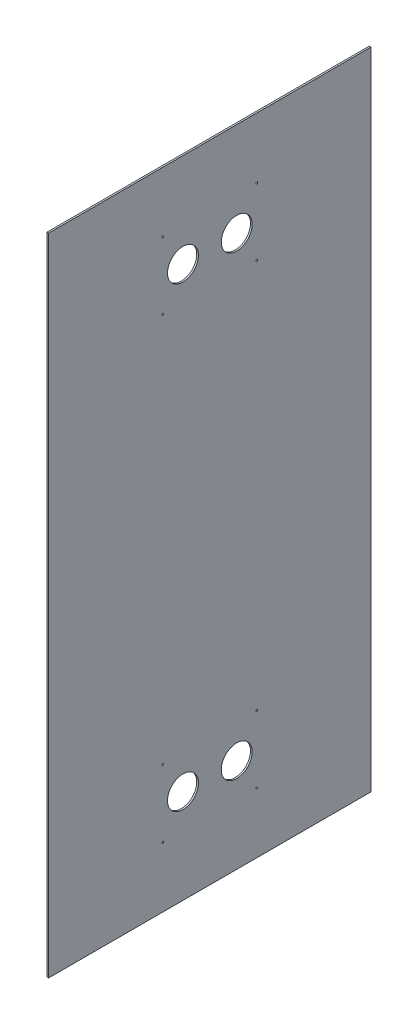
ISO-10303-21;
HEADER;
FILE_DESCRIPTION(('STEP AP214'),'2;1');
FILE_NAME('part.step','',(''),(''),'','','');
FILE_SCHEMA(('AUTOMOTIVE_DESIGN { 1 0 10303 214 1 1 1 1 }'));
ENDSEC;
DATA;
#1=APPLICATION_CONTEXT('core data for automotive mechanical design processes');
#2=APPLICATION_PROTOCOL_DEFINITION('international standard','automotive_design',2000,#1);
#3=PRODUCT_CONTEXT('',#1,'mechanical');
#4=PRODUCT('Part','Part','',(#3));
#5=PRODUCT_RELATED_PRODUCT_CATEGORY('part','',(#4));
#6=PRODUCT_DEFINITION_FORMATION('','',#4);
#7=PRODUCT_DEFINITION_CONTEXT('part definition',#1,'design');
#8=PRODUCT_DEFINITION('design','',#6,#7);
#9=PRODUCT_DEFINITION_SHAPE('','',#8);
#10=(LENGTH_UNIT() NAMED_UNIT(*) SI_UNIT(.MILLI.,.METRE.));
#11=(NAMED_UNIT(*) PLANE_ANGLE_UNIT() SI_UNIT($,.RADIAN.));
#12=(NAMED_UNIT(*) SI_UNIT($,.STERADIAN.) SOLID_ANGLE_UNIT());
#13=UNCERTAINTY_MEASURE_WITH_UNIT(LENGTH_MEASURE(1.E-05),#10,'distance_accuracy_value','');
#14=(GEOMETRIC_REPRESENTATION_CONTEXT(3) GLOBAL_UNCERTAINTY_ASSIGNED_CONTEXT((#13)) GLOBAL_UNIT_ASSIGNED_CONTEXT((#10,
#11,#12)) REPRESENTATION_CONTEXT('',''));
#15=CARTESIAN_POINT('',(0.,0.,0.));
#16=DIRECTION('',(0.,0.,1.));
#17=DIRECTION('',(1.,0.,0.));
#18=AXIS2_PLACEMENT_3D('',#15,#16,#17);
#19=CARTESIAN_POINT('',(3.175,-609.6,304.8));
#20=DIRECTION('',(0.,0.,-1.));
#21=DIRECTION('',(-1.,0.,0.));
#22=AXIS2_PLACEMENT_3D('',#19,#20,#21);
#23=PLANE('',#22);
#24=DIRECTION('',(0.,-1.,0.));
#25=VECTOR('',#24,1.);
#26=CARTESIAN_POINT('',(0.,-609.6,304.8));
#27=LINE('',#26,#25);
#28=CARTESIAN_POINT('',(0.,609.6,304.8));
#29=VERTEX_POINT('',#28);
#30=CARTESIAN_POINT('',(0.,-609.6,304.8));
#31=VERTEX_POINT('',#30);
#32=EDGE_CURVE('E100',#29,#31,#27,.T.);
#33=ORIENTED_EDGE('',*,*,#32,.T.);
#34=DIRECTION('',(-1.,0.,0.));
#35=VECTOR('',#34,1.);
#36=CARTESIAN_POINT('',(3.175,-609.6,304.8));
#37=LINE('',#36,#35);
#38=CARTESIAN_POINT('',(3.175,-609.6,304.8));
#39=VERTEX_POINT('',#38);
#40=EDGE_CURVE('E11',#39,#31,#37,.T.);
#41=ORIENTED_EDGE('',*,*,#40,.F.);
#42=DIRECTION('',(0.,-1.,0.));
#43=VECTOR('',#42,1.);
#44=CARTESIAN_POINT('',(3.175,-609.6,304.8));
#45=LINE('',#44,#43);
#46=CARTESIAN_POINT('',(3.175,609.6,304.8));
#47=VERTEX_POINT('',#46);
#48=EDGE_CURVE('E88',#47,#39,#45,.T.);
#49=ORIENTED_EDGE('',*,*,#48,.F.);
#50=DIRECTION('',(-1.,0.,0.));
#51=VECTOR('',#50,1.);
#52=CARTESIAN_POINT('',(3.175,609.6,304.8));
#53=LINE('',#52,#51);
#54=EDGE_CURVE('E96',#47,#29,#53,.T.);
#55=ORIENTED_EDGE('',*,*,#54,.T.);
#56=EDGE_LOOP('',(#33,#41,#49,#55));
#57=FACE_BOUND('',#56,.T.);
#58=ADVANCED_FACE('F37',(#57),#23,.F.);
#59=CARTESIAN_POINT('',(3.175,-609.6,-304.8));
#60=DIRECTION('',(0.,1.,0.));
#61=DIRECTION('',(0.,0.,1.));
#62=AXIS2_PLACEMENT_3D('',#59,#60,#61);
#63=PLANE('',#62);
#64=DIRECTION('',(0.,0.,-1.));
#65=VECTOR('',#64,1.);
#66=CARTESIAN_POINT('',(0.,-609.6,-304.8));
#67=LINE('',#66,#65);
#68=CARTESIAN_POINT('',(0.,-609.6,-304.8));
#69=VERTEX_POINT('',#68);
#70=EDGE_CURVE('E92',#31,#69,#67,.T.);
#71=ORIENTED_EDGE('',*,*,#70,.T.);
#72=DIRECTION('',(-1.,0.,0.));
#73=VECTOR('',#72,1.);
#74=CARTESIAN_POINT('',(3.175,-609.6,-304.8));
#75=LINE('',#74,#73);
#76=CARTESIAN_POINT('',(3.175,-609.6,-304.8));
#77=VERTEX_POINT('',#76);
#78=EDGE_CURVE('E45',#77,#69,#75,.T.);
#79=ORIENTED_EDGE('',*,*,#78,.F.);
#80=DIRECTION('',(0.,0.,-1.));
#81=VECTOR('',#80,1.);
#82=CARTESIAN_POINT('',(3.175,-609.6,-304.8));
#83=LINE('',#82,#81);
#84=EDGE_CURVE('E83',#39,#77,#83,.T.);
#85=ORIENTED_EDGE('',*,*,#84,.F.);
#86=ORIENTED_EDGE('',*,*,#40,.T.);
#87=EDGE_LOOP('',(#71,#79,#85,#86));
#88=FACE_BOUND('',#87,.T.);
#89=ADVANCED_FACE('F91',(#88),#63,.F.);
#90=CARTESIAN_POINT('',(3.175,-609.6,-304.8));
#91=DIRECTION('',(0.,0.,1.));
#92=DIRECTION('',(1.,0.,0.));
#93=AXIS2_PLACEMENT_3D('',#90,#91,#92);
#94=PLANE('',#93);
#95=DIRECTION('',(0.,1.,0.));
#96=VECTOR('',#95,1.);
#97=CARTESIAN_POINT('',(0.,-609.6,-304.8));
#98=LINE('',#97,#96);
#99=CARTESIAN_POINT('',(0.,609.6,-304.8));
#100=VERTEX_POINT('',#99);
#101=EDGE_CURVE('E70',#69,#100,#98,.T.);
#102=ORIENTED_EDGE('',*,*,#101,.T.);
#103=DIRECTION('',(-1.,0.,0.));
#104=VECTOR('',#103,1.);
#105=CARTESIAN_POINT('',(3.175,609.6,-304.8));
#106=LINE('',#105,#104);
#107=CARTESIAN_POINT('',(3.175,609.6,-304.8));
#108=VERTEX_POINT('',#107);
#109=EDGE_CURVE('E93',#108,#100,#106,.T.);
#110=ORIENTED_EDGE('',*,*,#109,.F.);
#111=DIRECTION('',(0.,1.,0.));
#112=VECTOR('',#111,1.);
#113=CARTESIAN_POINT('',(3.175,-609.6,-304.8));
#114=LINE('',#113,#112);
#115=EDGE_CURVE('E86',#77,#108,#114,.T.);
#116=ORIENTED_EDGE('',*,*,#115,.F.);
#117=ORIENTED_EDGE('',*,*,#78,.T.);
#118=EDGE_LOOP('',(#102,#110,#116,#117));
#119=FACE_BOUND('',#118,.T.);
#120=ADVANCED_FACE('F94',(#119),#94,.F.);
#121=CARTESIAN_POINT('',(3.175,609.6,-304.8));
#122=DIRECTION('',(0.,-1.,0.));
#123=DIRECTION('',(0.,0.,-1.));
#124=AXIS2_PLACEMENT_3D('',#121,#122,#123);
#125=PLANE('',#124);
#126=DIRECTION('',(0.,0.,1.));
#127=VECTOR('',#126,1.);
#128=CARTESIAN_POINT('',(0.,609.6,-304.8));
#129=LINE('',#128,#127);
#130=EDGE_CURVE('E76',#100,#29,#129,.T.);
#131=ORIENTED_EDGE('',*,*,#130,.T.);
#132=ORIENTED_EDGE('',*,*,#54,.F.);
#133=DIRECTION('',(0.,0.,1.));
#134=VECTOR('',#133,1.);
#135=CARTESIAN_POINT('',(3.175,609.6,-304.8));
#136=LINE('',#135,#134);
#137=EDGE_CURVE('E53',#108,#47,#136,.T.);
#138=ORIENTED_EDGE('',*,*,#137,.F.);
#139=ORIENTED_EDGE('',*,*,#109,.T.);
#140=EDGE_LOOP('',(#131,#132,#138,#139));
#141=FACE_BOUND('',#140,.T.);
#142=ADVANCED_FACE('F108',(#141),#125,.F.);
#143=CARTESIAN_POINT('',(3.175,0.,0.));
#144=DIRECTION('',(1.,0.,0.));
#145=DIRECTION('',(0.,0.,-1.));
#146=AXIS2_PLACEMENT_3D('',#143,#144,#145);
#147=PLANE('',#146);
#148=CARTESIAN_POINT('',(3.175,368.3,-88.8999999999999));
#149=DIRECTION('',(-1.,0.,0.));
#150=DIRECTION('',(0.,0.,-1.));
#151=AXIS2_PLACEMENT_3D('',#148,#149,#150);
#152=CIRCLE('',#151,1.58749999999993);
#153=CARTESIAN_POINT('',(3.175,368.3,-90.4874999999999));
#154=VERTEX_POINT('',#153);
#155=EDGE_CURVE('E175',#154,#154,#152,.T.);
#156=ORIENTED_EDGE('',*,*,#155,.T.);
#157=EDGE_LOOP('',(#156));
#158=FACE_BOUND('',#157,.T.);
#159=CARTESIAN_POINT('',(3.175,495.3,88.9));
#160=DIRECTION('',(-1.,0.,0.));
#161=DIRECTION('',(0.,0.,-1.));
#162=AXIS2_PLACEMENT_3D('',#159,#160,#161);
#163=CIRCLE('',#162,1.58750000000005);
#164=CARTESIAN_POINT('',(3.175,495.3,87.3125));
#165=VERTEX_POINT('',#164);
#166=EDGE_CURVE('E168',#165,#165,#163,.T.);
#167=ORIENTED_EDGE('',*,*,#166,.T.);
#168=EDGE_LOOP('',(#167));
#169=FACE_BOUND('',#168,.T.);
#170=CARTESIAN_POINT('',(3.175,495.3,-88.9));
#171=DIRECTION('',(-1.,0.,0.));
#172=DIRECTION('',(0.,0.,-1.));
#173=AXIS2_PLACEMENT_3D('',#170,#171,#172);
#174=CIRCLE('',#173,1.58750000000005);
#175=CARTESIAN_POINT('',(3.175,495.3,-90.4875));
#176=VERTEX_POINT('',#175);
#177=EDGE_CURVE('E180',#176,#176,#174,.T.);
#178=ORIENTED_EDGE('',*,*,#177,.T.);
#179=EDGE_LOOP('',(#178));
#180=FACE_BOUND('',#179,.T.);
#181=CARTESIAN_POINT('',(3.175,368.3,88.9000000000001));
#182=DIRECTION('',(-1.,0.,0.));
#183=DIRECTION('',(0.,0.,-1.));
#184=AXIS2_PLACEMENT_3D('',#181,#182,#183);
#185=CIRCLE('',#184,1.58750000000005);
#186=CARTESIAN_POINT('',(3.175,368.3,87.3125));
#187=VERTEX_POINT('',#186);
#188=EDGE_CURVE('E162',#187,#187,#185,.T.);
#189=ORIENTED_EDGE('',*,*,#188,.T.);
#190=EDGE_LOOP('',(#189));
#191=FACE_BOUND('',#190,.T.);
#192=CARTESIAN_POINT('',(3.175,431.8,50.8000000000001));
#193=DIRECTION('',(-1.,0.,0.));
#194=DIRECTION('',(0.,0.,-1.));
#195=AXIS2_PLACEMENT_3D('',#192,#193,#194);
#196=CIRCLE('',#195,29.21);
#197=CARTESIAN_POINT('',(3.175,431.8,21.5900000000001));
#198=VERTEX_POINT('',#197);
#199=EDGE_CURVE('E157',#198,#198,#196,.T.);
#200=ORIENTED_EDGE('',*,*,#199,.T.);
#201=EDGE_LOOP('',(#200));
#202=FACE_BOUND('',#201,.T.);
#203=CARTESIAN_POINT('',(3.175,431.8,-50.8));
#204=DIRECTION('',(-1.,0.,0.));
#205=DIRECTION('',(0.,0.,-1.));
#206=AXIS2_PLACEMENT_3D('',#203,#204,#205);
#207=CIRCLE('',#206,29.21);
#208=CARTESIAN_POINT('',(3.175,431.8,-80.01));
#209=VERTEX_POINT('',#208);
#210=EDGE_CURVE('E150',#209,#209,#207,.T.);
#211=ORIENTED_EDGE('',*,*,#210,.T.);
#212=EDGE_LOOP('',(#211));
#213=FACE_BOUND('',#212,.T.);
#214=CARTESIAN_POINT('',(3.175,-368.3,-88.8999999999999));
#215=DIRECTION('',(1.,0.,0.));
#216=DIRECTION('',(0.,0.,-1.));
#217=AXIS2_PLACEMENT_3D('',#214,#215,#216);
#218=CIRCLE('',#217,1.58749999999993);
#219=CARTESIAN_POINT('',(3.175,-368.3,-90.4874999999999));
#220=VERTEX_POINT('',#219);
#221=EDGE_CURVE('E139',#220,#220,#218,.T.);
#222=ORIENTED_EDGE('',*,*,#221,.F.);
#223=EDGE_LOOP('',(#222));
#224=FACE_BOUND('',#223,.T.);
#225=CARTESIAN_POINT('',(3.175,-495.3,88.9));
#226=DIRECTION('',(1.,0.,0.));
#227=DIRECTION('',(0.,0.,-1.));
#228=AXIS2_PLACEMENT_3D('',#225,#226,#227);
#229=CIRCLE('',#228,1.58750000000005);
#230=CARTESIAN_POINT('',(3.175,-495.3,87.3125));
#231=VERTEX_POINT('',#230);
#232=EDGE_CURVE('E132',#231,#231,#229,.T.);
#233=ORIENTED_EDGE('',*,*,#232,.F.);
#234=EDGE_LOOP('',(#233));
#235=FACE_BOUND('',#234,.T.);
#236=CARTESIAN_POINT('',(3.175,-495.3,-88.9));
#237=DIRECTION('',(1.,0.,0.));
#238=DIRECTION('',(0.,0.,-1.));
#239=AXIS2_PLACEMENT_3D('',#236,#237,#238);
#240=CIRCLE('',#239,1.58750000000005);
#241=CARTESIAN_POINT('',(3.175,-495.3,-90.4875));
#242=VERTEX_POINT('',#241);
#243=EDGE_CURVE('E144',#242,#242,#240,.T.);
#244=ORIENTED_EDGE('',*,*,#243,.F.);
#245=EDGE_LOOP('',(#244));
#246=FACE_BOUND('',#245,.T.);
#247=CARTESIAN_POINT('',(3.175,-368.3,88.9000000000001));
#248=DIRECTION('',(1.,0.,0.));
#249=DIRECTION('',(0.,0.,-1.));
#250=AXIS2_PLACEMENT_3D('',#247,#248,#249);
#251=CIRCLE('',#250,1.58750000000005);
#252=CARTESIAN_POINT('',(3.175,-368.3,87.3125));
#253=VERTEX_POINT('',#252);
#254=EDGE_CURVE('E126',#253,#253,#251,.T.);
#255=ORIENTED_EDGE('',*,*,#254,.F.);
#256=EDGE_LOOP('',(#255));
#257=FACE_BOUND('',#256,.T.);
#258=CARTESIAN_POINT('',(3.175,-431.8,50.8000000000001));
#259=DIRECTION('',(1.,0.,0.));
#260=DIRECTION('',(0.,0.,-1.));
#261=AXIS2_PLACEMENT_3D('',#258,#259,#260);
#262=CIRCLE('',#261,29.21);
#263=CARTESIAN_POINT('',(3.175,-431.8,21.5900000000001));
#264=VERTEX_POINT('',#263);
#265=EDGE_CURVE('E121',#264,#264,#262,.T.);
#266=ORIENTED_EDGE('',*,*,#265,.F.);
#267=EDGE_LOOP('',(#266));
#268=FACE_BOUND('',#267,.T.);
#269=CARTESIAN_POINT('',(3.175,-431.8,-50.8));
#270=DIRECTION('',(1.,0.,0.));
#271=DIRECTION('',(0.,0.,-1.));
#272=AXIS2_PLACEMENT_3D('',#269,#270,#271);
#273=CIRCLE('',#272,29.21);
#274=CARTESIAN_POINT('',(3.175,-431.8,-80.01));
#275=VERTEX_POINT('',#274);
#276=EDGE_CURVE('E114',#275,#275,#273,.T.);
#277=ORIENTED_EDGE('',*,*,#276,.F.);
#278=EDGE_LOOP('',(#277));
#279=FACE_BOUND('',#278,.T.);
#280=ORIENTED_EDGE('',*,*,#48,.T.);
#281=ORIENTED_EDGE('',*,*,#84,.T.);
#282=ORIENTED_EDGE('',*,*,#115,.T.);
#283=ORIENTED_EDGE('',*,*,#137,.T.);
#284=EDGE_LOOP('',(#280,#281,#282,#283));
#285=FACE_BOUND('',#284,.T.);
#286=ADVANCED_FACE('F84',(#158,#169,#180,#191,#202,#213,#224,#235,#246,#257,#268,#279,#285),
#147,.T.);
#287=CARTESIAN_POINT('',(0.,0.,0.));
#288=DIRECTION('',(1.,0.,0.));
#289=DIRECTION('',(0.,0.,-1.));
#290=AXIS2_PLACEMENT_3D('',#287,#288,#289);
#291=PLANE('',#290);
#292=CARTESIAN_POINT('',(0.,368.3,-88.8999999999999));
#293=DIRECTION('',(-1.,0.,0.));
#294=DIRECTION('',(0.,0.,-1.));
#295=AXIS2_PLACEMENT_3D('',#292,#293,#294);
#296=CIRCLE('',#295,1.58749999999993);
#297=CARTESIAN_POINT('',(0.,368.3,-90.4874999999999));
#298=VERTEX_POINT('',#297);
#299=EDGE_CURVE('E165',#298,#298,#296,.T.);
#300=ORIENTED_EDGE('',*,*,#299,.F.);
#301=EDGE_LOOP('',(#300));
#302=FACE_BOUND('',#301,.T.);
#303=CARTESIAN_POINT('',(0.,495.3,88.9));
#304=DIRECTION('',(-1.,0.,0.));
#305=DIRECTION('',(0.,0.,-1.));
#306=AXIS2_PLACEMENT_3D('',#303,#304,#305);
#307=CIRCLE('',#306,1.58750000000005);
#308=CARTESIAN_POINT('',(0.,495.3,87.3125));
#309=VERTEX_POINT('',#308);
#310=EDGE_CURVE('E171',#309,#309,#307,.T.);
#311=ORIENTED_EDGE('',*,*,#310,.F.);
#312=EDGE_LOOP('',(#311));
#313=FACE_BOUND('',#312,.T.);
#314=CARTESIAN_POINT('',(0.,495.3,-88.9));
#315=DIRECTION('',(-1.,0.,0.));
#316=DIRECTION('',(0.,0.,-1.));
#317=AXIS2_PLACEMENT_3D('',#314,#315,#316);
#318=CIRCLE('',#317,1.58750000000005);
#319=CARTESIAN_POINT('',(0.,495.3,-90.4875));
#320=VERTEX_POINT('',#319);
#321=EDGE_CURVE('E172',#320,#320,#318,.T.);
#322=ORIENTED_EDGE('',*,*,#321,.F.);
#323=EDGE_LOOP('',(#322));
#324=FACE_BOUND('',#323,.T.);
#325=CARTESIAN_POINT('',(0.,368.3,88.9000000000001));
#326=DIRECTION('',(-1.,0.,0.));
#327=DIRECTION('',(0.,0.,-1.));
#328=AXIS2_PLACEMENT_3D('',#325,#326,#327);
#329=CIRCLE('',#328,1.58750000000005);
#330=CARTESIAN_POINT('',(0.,368.3,87.3125));
#331=VERTEX_POINT('',#330);
#332=EDGE_CURVE('E154',#331,#331,#329,.T.);
#333=ORIENTED_EDGE('',*,*,#332,.F.);
#334=EDGE_LOOP('',(#333));
#335=FACE_BOUND('',#334,.T.);
#336=CARTESIAN_POINT('',(0.,431.8,50.8000000000001));
#337=DIRECTION('',(-1.,0.,0.));
#338=DIRECTION('',(0.,0.,-1.));
#339=AXIS2_PLACEMENT_3D('',#336,#337,#338);
#340=CIRCLE('',#339,29.21);
#341=CARTESIAN_POINT('',(0.,431.8,21.5900000000001));
#342=VERTEX_POINT('',#341);
#343=EDGE_CURVE('E147',#342,#342,#340,.T.);
#344=ORIENTED_EDGE('',*,*,#343,.F.);
#345=EDGE_LOOP('',(#344));
#346=FACE_BOUND('',#345,.T.);
#347=CARTESIAN_POINT('',(0.,431.8,-50.8));
#348=DIRECTION('',(-1.,0.,0.));
#349=DIRECTION('',(0.,0.,-1.));
#350=AXIS2_PLACEMENT_3D('',#347,#348,#349);
#351=CIRCLE('',#350,29.21);
#352=CARTESIAN_POINT('',(0.,431.8,-80.01));
#353=VERTEX_POINT('',#352);
#354=EDGE_CURVE('E153',#353,#353,#351,.T.);
#355=ORIENTED_EDGE('',*,*,#354,.F.);
#356=EDGE_LOOP('',(#355));
#357=FACE_BOUND('',#356,.T.);
#358=CARTESIAN_POINT('',(0.,-368.3,-88.8999999999999));
#359=DIRECTION('',(1.,0.,0.));
#360=DIRECTION('',(0.,0.,-1.));
#361=AXIS2_PLACEMENT_3D('',#358,#359,#360);
#362=CIRCLE('',#361,1.58749999999993);
#363=CARTESIAN_POINT('',(0.,-368.3,-90.4874999999999));
#364=VERTEX_POINT('',#363);
#365=EDGE_CURVE('E129',#364,#364,#362,.T.);
#366=ORIENTED_EDGE('',*,*,#365,.T.);
#367=EDGE_LOOP('',(#366));
#368=FACE_BOUND('',#367,.T.);
#369=CARTESIAN_POINT('',(0.,-495.3,88.9));
#370=DIRECTION('',(1.,0.,0.));
#371=DIRECTION('',(0.,0.,-1.));
#372=AXIS2_PLACEMENT_3D('',#369,#370,#371);
#373=CIRCLE('',#372,1.58750000000005);
#374=CARTESIAN_POINT('',(0.,-495.3,87.3125));
#375=VERTEX_POINT('',#374);
#376=EDGE_CURVE('E135',#375,#375,#373,.T.);
#377=ORIENTED_EDGE('',*,*,#376,.T.);
#378=EDGE_LOOP('',(#377));
#379=FACE_BOUND('',#378,.T.);
#380=CARTESIAN_POINT('',(0.,-495.3,-88.9));
#381=DIRECTION('',(1.,0.,0.));
#382=DIRECTION('',(0.,0.,-1.));
#383=AXIS2_PLACEMENT_3D('',#380,#381,#382);
#384=CIRCLE('',#383,1.58750000000005);
#385=CARTESIAN_POINT('',(0.,-495.3,-90.4875));
#386=VERTEX_POINT('',#385);
#387=EDGE_CURVE('E136',#386,#386,#384,.T.);
#388=ORIENTED_EDGE('',*,*,#387,.T.);
#389=EDGE_LOOP('',(#388));
#390=FACE_BOUND('',#389,.T.);
#391=CARTESIAN_POINT('',(0.,-368.3,88.9000000000001));
#392=DIRECTION('',(1.,0.,0.));
#393=DIRECTION('',(0.,0.,-1.));
#394=AXIS2_PLACEMENT_3D('',#391,#392,#393);
#395=CIRCLE('',#394,1.58750000000005);
#396=CARTESIAN_POINT('',(0.,-368.3,87.3125));
#397=VERTEX_POINT('',#396);
#398=EDGE_CURVE('E118',#397,#397,#395,.T.);
#399=ORIENTED_EDGE('',*,*,#398,.T.);
#400=EDGE_LOOP('',(#399));
#401=FACE_BOUND('',#400,.T.);
#402=CARTESIAN_POINT('',(0.,-431.8,50.8000000000001));
#403=DIRECTION('',(1.,0.,0.));
#404=DIRECTION('',(0.,0.,-1.));
#405=AXIS2_PLACEMENT_3D('',#402,#403,#404);
#406=CIRCLE('',#405,29.21);
#407=CARTESIAN_POINT('',(0.,-431.8,21.5900000000001));
#408=VERTEX_POINT('',#407);
#409=EDGE_CURVE('E103',#408,#408,#406,.T.);
#410=ORIENTED_EDGE('',*,*,#409,.T.);
#411=EDGE_LOOP('',(#410));
#412=FACE_BOUND('',#411,.T.);
#413=CARTESIAN_POINT('',(0.,-431.8,-50.8));
#414=DIRECTION('',(1.,0.,0.));
#415=DIRECTION('',(0.,0.,-1.));
#416=AXIS2_PLACEMENT_3D('',#413,#414,#415);
#417=CIRCLE('',#416,29.21);
#418=CARTESIAN_POINT('',(0.,-431.8,-80.01));
#419=VERTEX_POINT('',#418);
#420=EDGE_CURVE('E117',#419,#419,#417,.T.);
#421=ORIENTED_EDGE('',*,*,#420,.T.);
#422=EDGE_LOOP('',(#421));
#423=FACE_BOUND('',#422,.T.);
#424=ORIENTED_EDGE('',*,*,#32,.F.);
#425=ORIENTED_EDGE('',*,*,#130,.F.);
#426=ORIENTED_EDGE('',*,*,#101,.F.);
#427=ORIENTED_EDGE('',*,*,#70,.F.);
#428=EDGE_LOOP('',(#424,#425,#426,#427));
#429=FACE_BOUND('',#428,.T.);
#430=ADVANCED_FACE('F111',(#302,#313,#324,#335,#346,#357,#368,#379,#390,#401,#412,#423,#429),
#291,.F.);
#431=CARTESIAN_POINT('',(0.,-431.8,-50.8));
#432=DIRECTION('',(1.,0.,0.));
#433=DIRECTION('',(0.,0.,-1.));
#434=AXIS2_PLACEMENT_3D('',#431,#432,#433);
#435=CYLINDRICAL_SURFACE('',#434,29.21);
#436=ORIENTED_EDGE('',*,*,#420,.F.);
#437=EDGE_LOOP('',(#436));
#438=FACE_BOUND('',#437,.T.);
#439=ORIENTED_EDGE('',*,*,#276,.T.);
#440=EDGE_LOOP('',(#439));
#441=FACE_BOUND('',#440,.T.);
#442=ADVANCED_FACE('F191',(#438,#441),#435,.F.);
#443=CARTESIAN_POINT('',(0.,-431.8,50.8000000000001));
#444=DIRECTION('',(1.,0.,0.));
#445=DIRECTION('',(0.,0.,-1.));
#446=AXIS2_PLACEMENT_3D('',#443,#444,#445);
#447=CYLINDRICAL_SURFACE('',#446,29.21);
#448=ORIENTED_EDGE('',*,*,#409,.F.);
#449=EDGE_LOOP('',(#448));
#450=FACE_BOUND('',#449,.T.);
#451=ORIENTED_EDGE('',*,*,#265,.T.);
#452=EDGE_LOOP('',(#451));
#453=FACE_BOUND('',#452,.T.);
#454=ADVANCED_FACE('F214',(#450,#453),#447,.F.);
#455=CARTESIAN_POINT('',(0.,-368.3,88.9000000000001));
#456=DIRECTION('',(1.,0.,0.));
#457=DIRECTION('',(0.,0.,-1.));
#458=AXIS2_PLACEMENT_3D('',#455,#456,#457);
#459=CYLINDRICAL_SURFACE('',#458,1.58750000000005);
#460=ORIENTED_EDGE('',*,*,#398,.F.);
#461=EDGE_LOOP('',(#460));
#462=FACE_BOUND('',#461,.T.);
#463=ORIENTED_EDGE('',*,*,#254,.T.);
#464=EDGE_LOOP('',(#463));
#465=FACE_BOUND('',#464,.T.);
#466=ADVANCED_FACE('F257',(#462,#465),#459,.F.);
#467=CARTESIAN_POINT('',(0.,-495.3,-88.9));
#468=DIRECTION('',(1.,0.,0.));
#469=DIRECTION('',(0.,0.,-1.));
#470=AXIS2_PLACEMENT_3D('',#467,#468,#469);
#471=CYLINDRICAL_SURFACE('',#470,1.58750000000005);
#472=ORIENTED_EDGE('',*,*,#387,.F.);
#473=EDGE_LOOP('',(#472));
#474=FACE_BOUND('',#473,.T.);
#475=ORIENTED_EDGE('',*,*,#243,.T.);
#476=EDGE_LOOP('',(#475));
#477=FACE_BOUND('',#476,.T.);
#478=ADVANCED_FACE('F267',(#474,#477),#471,.F.);
#479=CARTESIAN_POINT('',(0.,-495.3,88.9));
#480=DIRECTION('',(1.,0.,0.));
#481=DIRECTION('',(0.,0.,-1.));
#482=AXIS2_PLACEMENT_3D('',#479,#480,#481);
#483=CYLINDRICAL_SURFACE('',#482,1.58750000000005);
#484=ORIENTED_EDGE('',*,*,#376,.F.);
#485=EDGE_LOOP('',(#484));
#486=FACE_BOUND('',#485,.T.);
#487=ORIENTED_EDGE('',*,*,#232,.T.);
#488=EDGE_LOOP('',(#487));
#489=FACE_BOUND('',#488,.T.);
#490=ADVANCED_FACE('F277',(#486,#489),#483,.F.);
#491=CARTESIAN_POINT('',(0.,-368.3,-88.8999999999999));
#492=DIRECTION('',(1.,0.,0.));
#493=DIRECTION('',(0.,0.,-1.));
#494=AXIS2_PLACEMENT_3D('',#491,#492,#493);
#495=CYLINDRICAL_SURFACE('',#494,1.58749999999993);
#496=ORIENTED_EDGE('',*,*,#365,.F.);
#497=EDGE_LOOP('',(#496));
#498=FACE_BOUND('',#497,.T.);
#499=ORIENTED_EDGE('',*,*,#221,.T.);
#500=EDGE_LOOP('',(#499));
#501=FACE_BOUND('',#500,.T.);
#502=ADVANCED_FACE('F287',(#498,#501),#495,.F.);
#503=CARTESIAN_POINT('',(0.,431.8,-50.8));
#504=DIRECTION('',(1.,0.,0.));
#505=DIRECTION('',(0.,0.,-1.));
#506=AXIS2_PLACEMENT_3D('',#503,#504,#505);
#507=CYLINDRICAL_SURFACE('',#506,29.21);
#508=ORIENTED_EDGE('',*,*,#354,.T.);
#509=EDGE_LOOP('',(#508));
#510=FACE_BOUND('',#509,.T.);
#511=ORIENTED_EDGE('',*,*,#210,.F.);
#512=EDGE_LOOP('',(#511));
#513=FACE_BOUND('',#512,.T.);
#514=ADVANCED_FACE('F296',(#510,#513),#507,.F.);
#515=CARTESIAN_POINT('',(0.,431.8,50.8000000000001));
#516=DIRECTION('',(1.,0.,0.));
#517=DIRECTION('',(0.,0.,-1.));
#518=AXIS2_PLACEMENT_3D('',#515,#516,#517);
#519=CYLINDRICAL_SURFACE('',#518,29.21);
#520=ORIENTED_EDGE('',*,*,#343,.T.);
#521=EDGE_LOOP('',(#520));
#522=FACE_BOUND('',#521,.T.);
#523=ORIENTED_EDGE('',*,*,#199,.F.);
#524=EDGE_LOOP('',(#523));
#525=FACE_BOUND('',#524,.T.);
#526=ADVANCED_FACE('F315',(#522,#525),#519,.F.);
#527=CARTESIAN_POINT('',(0.,368.3,88.9000000000001));
#528=DIRECTION('',(1.,0.,0.));
#529=DIRECTION('',(0.,0.,-1.));
#530=AXIS2_PLACEMENT_3D('',#527,#528,#529);
#531=CYLINDRICAL_SURFACE('',#530,1.58750000000005);
#532=ORIENTED_EDGE('',*,*,#332,.T.);
#533=EDGE_LOOP('',(#532));
#534=FACE_BOUND('',#533,.T.);
#535=ORIENTED_EDGE('',*,*,#188,.F.);
#536=EDGE_LOOP('',(#535));
#537=FACE_BOUND('',#536,.T.);
#538=ADVANCED_FACE('F325',(#534,#537),#531,.F.);
#539=CARTESIAN_POINT('',(0.,495.3,-88.9));
#540=DIRECTION('',(1.,0.,0.));
#541=DIRECTION('',(0.,0.,-1.));
#542=AXIS2_PLACEMENT_3D('',#539,#540,#541);
#543=CYLINDRICAL_SURFACE('',#542,1.58750000000005);
#544=ORIENTED_EDGE('',*,*,#321,.T.);
#545=EDGE_LOOP('',(#544));
#546=FACE_BOUND('',#545,.T.);
#547=ORIENTED_EDGE('',*,*,#177,.F.);
#548=EDGE_LOOP('',(#547));
#549=FACE_BOUND('',#548,.T.);
#550=ADVANCED_FACE('F186',(#546,#549),#543,.F.);
#551=CARTESIAN_POINT('',(0.,495.3,88.9));
#552=DIRECTION('',(1.,0.,0.));
#553=DIRECTION('',(0.,0.,-1.));
#554=AXIS2_PLACEMENT_3D('',#551,#552,#553);
#555=CYLINDRICAL_SURFACE('',#554,1.58750000000005);
#556=ORIENTED_EDGE('',*,*,#310,.T.);
#557=EDGE_LOOP('',(#556));
#558=FACE_BOUND('',#557,.T.);
#559=ORIENTED_EDGE('',*,*,#166,.F.);
#560=EDGE_LOOP('',(#559));
#561=FACE_BOUND('',#560,.T.);
#562=ADVANCED_FACE('F344',(#558,#561),#555,.F.);
#563=CARTESIAN_POINT('',(0.,368.3,-88.8999999999999));
#564=DIRECTION('',(1.,0.,0.));
#565=DIRECTION('',(0.,0.,-1.));
#566=AXIS2_PLACEMENT_3D('',#563,#564,#565);
#567=CYLINDRICAL_SURFACE('',#566,1.58749999999993);
#568=ORIENTED_EDGE('',*,*,#299,.T.);
#569=EDGE_LOOP('',(#568));
#570=FACE_BOUND('',#569,.T.);
#571=ORIENTED_EDGE('',*,*,#155,.F.);
#572=EDGE_LOOP('',(#571));
#573=FACE_BOUND('',#572,.T.);
#574=ADVANCED_FACE('F353',(#570,#573),#567,.F.);
#575=CLOSED_SHELL('',(#58,#89,#120,#142,#286,#430,#442,#454,#466,#478,#490,#502,#514,#526,#538,
#550,#562,#574));
#576=MANIFOLD_SOLID_BREP('B2',#575);
#577=ADVANCED_BREP_SHAPE_REPRESENTATION('',(#18,#576),#14);
#578=SHAPE_DEFINITION_REPRESENTATION(#9,#577);
ENDSEC;
END-ISO-10303-21;
